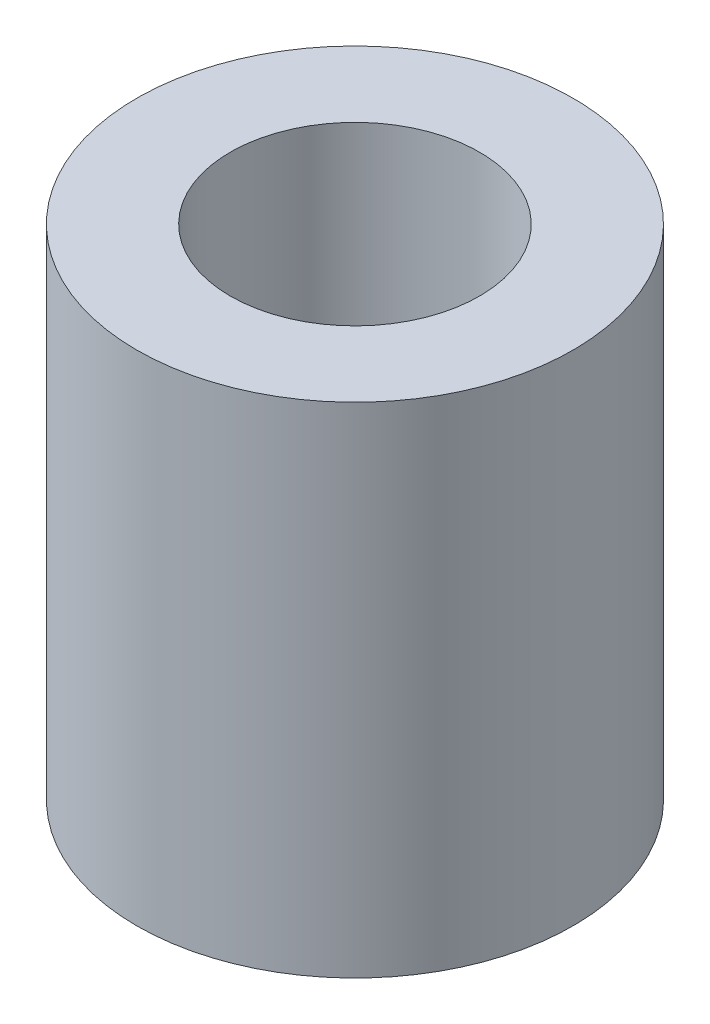
ISO-10303-21;
HEADER;
FILE_DESCRIPTION(('STEP AP214'),'2;1');
FILE_NAME('part.step','',(''),(''),'','','');
FILE_SCHEMA(('AUTOMOTIVE_DESIGN { 1 0 10303 214 1 1 1 1 }'));
ENDSEC;
DATA;
#1=APPLICATION_CONTEXT('core data for automotive mechanical design processes');
#2=APPLICATION_PROTOCOL_DEFINITION('international standard','automotive_design',2000,#1);
#3=PRODUCT_CONTEXT('',#1,'mechanical');
#4=PRODUCT('Part','Part','',(#3));
#5=PRODUCT_RELATED_PRODUCT_CATEGORY('part','',(#4));
#6=PRODUCT_DEFINITION_FORMATION('','',#4);
#7=PRODUCT_DEFINITION_CONTEXT('part definition',#1,'design');
#8=PRODUCT_DEFINITION('design','',#6,#7);
#9=PRODUCT_DEFINITION_SHAPE('','',#8);
#10=(LENGTH_UNIT() NAMED_UNIT(*) SI_UNIT(.MILLI.,.METRE.));
#11=(NAMED_UNIT(*) PLANE_ANGLE_UNIT() SI_UNIT($,.RADIAN.));
#12=(NAMED_UNIT(*) SI_UNIT($,.STERADIAN.) SOLID_ANGLE_UNIT());
#13=UNCERTAINTY_MEASURE_WITH_UNIT(LENGTH_MEASURE(1.E-05),#10,'distance_accuracy_value','');
#14=(GEOMETRIC_REPRESENTATION_CONTEXT(3) GLOBAL_UNCERTAINTY_ASSIGNED_CONTEXT((#13)) GLOBAL_UNIT_ASSIGNED_CONTEXT((#10,
#11,#12)) REPRESENTATION_CONTEXT('',''));
#15=CARTESIAN_POINT('',(0.,0.,0.));
#16=DIRECTION('',(0.,0.,1.));
#17=DIRECTION('',(1.,0.,0.));
#18=AXIS2_PLACEMENT_3D('',#15,#16,#17);
#19=CARTESIAN_POINT('',(0.,8.,0.));
#20=DIRECTION('',(0.,1.,0.));
#21=DIRECTION('',(0.,0.,1.));
#22=AXIS2_PLACEMENT_3D('',#19,#20,#21);
#23=PLANE('',#22);
#24=CARTESIAN_POINT('',(0.,8.,0.));
#25=DIRECTION('',(0.,1.,0.));
#26=DIRECTION('',(0.,0.,1.));
#27=AXIS2_PLACEMENT_3D('',#24,#25,#26);
#28=CIRCLE('',#27,3.5);
#29=CARTESIAN_POINT('',(0.,8.,3.5));
#30=VERTEX_POINT('',#29);
#31=EDGE_CURVE('E10',#30,#30,#28,.T.);
#32=ORIENTED_EDGE('',*,*,#31,.T.);
#33=EDGE_LOOP('',(#32));
#34=FACE_BOUND('',#33,.T.);
#35=CARTESIAN_POINT('',(0.,8.,0.));
#36=DIRECTION('',(0.,1.,0.));
#37=DIRECTION('',(0.,0.,1.));
#38=AXIS2_PLACEMENT_3D('',#35,#36,#37);
#39=CIRCLE('',#38,2.);
#40=CARTESIAN_POINT('',(0.,8.,2.));
#41=VERTEX_POINT('',#40);
#42=EDGE_CURVE('E44',#41,#41,#39,.T.);
#43=ORIENTED_EDGE('',*,*,#42,.F.);
#44=EDGE_LOOP('',(#43));
#45=FACE_BOUND('',#44,.T.);
#46=ADVANCED_FACE('F33',(#34,#45),#23,.T.);
#47=CARTESIAN_POINT('',(0.,0.,0.));
#48=DIRECTION('',(0.,1.,0.));
#49=DIRECTION('',(0.,0.,1.));
#50=AXIS2_PLACEMENT_3D('',#47,#48,#49);
#51=PLANE('',#50);
#52=CARTESIAN_POINT('',(0.,0.,0.));
#53=DIRECTION('',(0.,1.,0.));
#54=DIRECTION('',(0.,0.,1.));
#55=AXIS2_PLACEMENT_3D('',#52,#53,#54);
#56=CIRCLE('',#55,3.5);
#57=CARTESIAN_POINT('',(0.,0.,3.5));
#58=VERTEX_POINT('',#57);
#59=EDGE_CURVE('E37',#58,#58,#56,.T.);
#60=ORIENTED_EDGE('',*,*,#59,.F.);
#61=EDGE_LOOP('',(#60));
#62=FACE_BOUND('',#61,.T.);
#63=CARTESIAN_POINT('',(0.,0.,0.));
#64=DIRECTION('',(0.,1.,0.));
#65=DIRECTION('',(0.,0.,1.));
#66=AXIS2_PLACEMENT_3D('',#63,#64,#65);
#67=CIRCLE('',#66,2.);
#68=CARTESIAN_POINT('',(0.,0.,2.));
#69=VERTEX_POINT('',#68);
#70=EDGE_CURVE('E46',#69,#69,#67,.T.);
#71=ORIENTED_EDGE('',*,*,#70,.T.);
#72=EDGE_LOOP('',(#71));
#73=FACE_BOUND('',#72,.T.);
#74=ADVANCED_FACE('F56',(#62,#73),#51,.F.);
#75=CARTESIAN_POINT('',(0.,8.,0.));
#76=DIRECTION('',(0.,-1.,0.));
#77=DIRECTION('',(0.,0.,-1.));
#78=AXIS2_PLACEMENT_3D('',#75,#76,#77);
#79=CYLINDRICAL_SURFACE('',#78,3.5);
#80=ORIENTED_EDGE('',*,*,#31,.F.);
#81=EDGE_LOOP('',(#80));
#82=FACE_BOUND('',#81,.T.);
#83=ORIENTED_EDGE('',*,*,#59,.T.);
#84=EDGE_LOOP('',(#83));
#85=FACE_BOUND('',#84,.T.);
#86=ADVANCED_FACE('F35',(#82,#85),#79,.T.);
#87=CARTESIAN_POINT('',(0.,8.,0.));
#88=DIRECTION('',(0.,-1.,0.));
#89=DIRECTION('',(0.,0.,-1.));
#90=AXIS2_PLACEMENT_3D('',#87,#88,#89);
#91=CYLINDRICAL_SURFACE('',#90,2.);
#92=ORIENTED_EDGE('',*,*,#42,.T.);
#93=EDGE_LOOP('',(#92));
#94=FACE_BOUND('',#93,.T.);
#95=ORIENTED_EDGE('',*,*,#70,.F.);
#96=EDGE_LOOP('',(#95));
#97=FACE_BOUND('',#96,.T.);
#98=ADVANCED_FACE('F52',(#94,#97),#91,.F.);
#99=CLOSED_SHELL('',(#46,#74,#86,#98));
#100=MANIFOLD_SOLID_BREP('B2',#99);
#101=ADVANCED_BREP_SHAPE_REPRESENTATION('',(#18,#100),#14);
#102=SHAPE_DEFINITION_REPRESENTATION(#9,#101);
ENDSEC;
END-ISO-10303-21;
